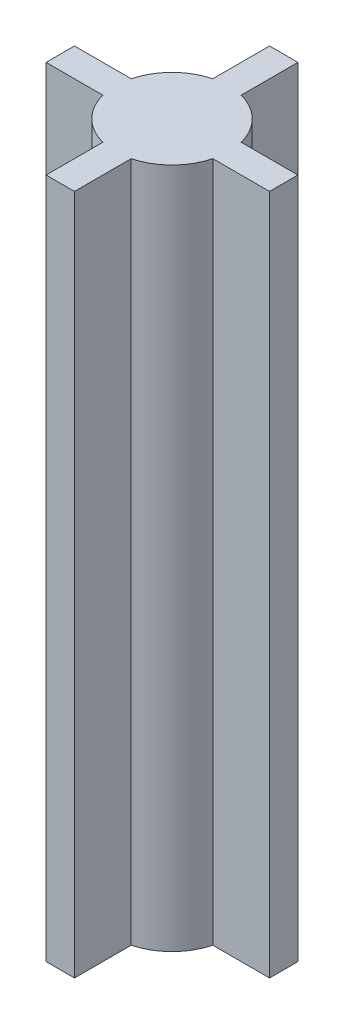
ISO-10303-21;
HEADER;
FILE_DESCRIPTION(('STEP AP214'),'2;1');
FILE_NAME('part.step','',(''),(''),'','','');
FILE_SCHEMA(('AUTOMOTIVE_DESIGN { 1 0 10303 214 1 1 1 1 }'));
ENDSEC;
DATA;
#1=APPLICATION_CONTEXT('core data for automotive mechanical design processes');
#2=APPLICATION_PROTOCOL_DEFINITION('international standard','automotive_design',2000,#1);
#3=PRODUCT_CONTEXT('',#1,'mechanical');
#4=PRODUCT('Part','Part','',(#3));
#5=PRODUCT_RELATED_PRODUCT_CATEGORY('part','',(#4));
#6=PRODUCT_DEFINITION_FORMATION('','',#4);
#7=PRODUCT_DEFINITION_CONTEXT('part definition',#1,'design');
#8=PRODUCT_DEFINITION('design','',#6,#7);
#9=PRODUCT_DEFINITION_SHAPE('','',#8);
#10=(LENGTH_UNIT() NAMED_UNIT(*) SI_UNIT(.MILLI.,.METRE.));
#11=(NAMED_UNIT(*) PLANE_ANGLE_UNIT() SI_UNIT($,.RADIAN.));
#12=(NAMED_UNIT(*) SI_UNIT($,.STERADIAN.) SOLID_ANGLE_UNIT());
#13=UNCERTAINTY_MEASURE_WITH_UNIT(LENGTH_MEASURE(1.E-05),#10,'distance_accuracy_value','');
#14=(GEOMETRIC_REPRESENTATION_CONTEXT(3) GLOBAL_UNCERTAINTY_ASSIGNED_CONTEXT((#13)) GLOBAL_UNIT_ASSIGNED_CONTEXT((#10,
#11,#12)) REPRESENTATION_CONTEXT('',''));
#15=CARTESIAN_POINT('',(0.,0.,0.));
#16=DIRECTION('',(0.,0.,1.));
#17=DIRECTION('',(1.,0.,0.));
#18=AXIS2_PLACEMENT_3D('',#15,#16,#17);
#19=CARTESIAN_POINT('',(0.,152.4,0.));
#20=DIRECTION('',(0.,-1.,0.));
#21=DIRECTION('',(0.,0.,-1.));
#22=AXIS2_PLACEMENT_3D('',#19,#20,#21);
#23=CYLINDRICAL_SURFACE('',#22,12.7);
#24=CARTESIAN_POINT('',(0.,0.,0.));
#25=DIRECTION('',(0.,1.,0.));
#26=DIRECTION('',(0.,0.,1.));
#27=AXIS2_PLACEMENT_3D('',#24,#25,#26);
#28=CIRCLE('',#27,12.7);
#29=CARTESIAN_POINT('',(-3.175,0.,-12.2967221242086));
#30=VERTEX_POINT('',#29);
#31=CARTESIAN_POINT('',(-12.2967221242079,0.,-3.17499999999941));
#32=VERTEX_POINT('',#31);
#33=EDGE_CURVE('E199',#30,#32,#28,.T.);
#34=ORIENTED_EDGE('',*,*,#33,.T.);
#35=DIRECTION('',(0.,-1.,0.));
#36=VECTOR('',#35,1.);
#37=CARTESIAN_POINT('',(-12.2967221242079,152.4,-3.17499999999941));
#38=LINE('',#37,#36);
#39=CARTESIAN_POINT('',(-12.2967221242079,152.4,-3.17499999999941));
#40=VERTEX_POINT('',#39);
#41=EDGE_CURVE('E11',#40,#32,#38,.T.);
#42=ORIENTED_EDGE('',*,*,#41,.F.);
#43=CARTESIAN_POINT('',(0.,152.4,0.));
#44=DIRECTION('',(0.,1.,0.));
#45=DIRECTION('',(0.,0.,1.));
#46=AXIS2_PLACEMENT_3D('',#43,#44,#45);
#47=CIRCLE('',#46,12.7);
#48=CARTESIAN_POINT('',(-3.175,152.4,-12.2967221242086));
#49=VERTEX_POINT('',#48);
#50=EDGE_CURVE('E250',#49,#40,#47,.T.);
#51=ORIENTED_EDGE('',*,*,#50,.F.);
#52=DIRECTION('',(0.,-1.,0.));
#53=VECTOR('',#52,1.);
#54=CARTESIAN_POINT('',(-3.175,152.4,-12.2967221242086));
#55=LINE('',#54,#53);
#56=EDGE_CURVE('E65',#49,#30,#55,.T.);
#57=ORIENTED_EDGE('',*,*,#56,.T.);
#58=EDGE_LOOP('',(#34,#42,#51,#57));
#59=FACE_BOUND('',#58,.T.);
#60=ADVANCED_FACE('F47',(#59),#23,.T.);
#61=CARTESIAN_POINT('',(0.,152.4,-3.17499999999922));
#62=DIRECTION('',(0.,0.,1.));
#63=DIRECTION('',(1.,0.,0.));
#64=AXIS2_PLACEMENT_3D('',#61,#62,#63);
#65=PLANE('',#64);
#66=DIRECTION('',(-1.,0.,0.));
#67=VECTOR('',#66,1.);
#68=CARTESIAN_POINT('',(0.,0.,-3.17499999999922));
#69=LINE('',#68,#67);
#70=CARTESIAN_POINT('',(-24.9967221242072,0.,-3.17499999999922));
#71=VERTEX_POINT('',#70);
#72=EDGE_CURVE('E202',#32,#71,#69,.T.);
#73=ORIENTED_EDGE('',*,*,#72,.T.);
#74=DIRECTION('',(0.,-1.,0.));
#75=VECTOR('',#74,1.);
#76=CARTESIAN_POINT('',(-24.9967221242072,152.4,-3.17499999999922));
#77=LINE('',#76,#75);
#78=CARTESIAN_POINT('',(-24.9967221242072,152.4,-3.17499999999922));
#79=VERTEX_POINT('',#78);
#80=EDGE_CURVE('E57',#79,#71,#77,.T.);
#81=ORIENTED_EDGE('',*,*,#80,.F.);
#82=DIRECTION('',(-1.,0.,0.));
#83=VECTOR('',#82,1.);
#84=CARTESIAN_POINT('',(0.,152.4,-3.17499999999922));
#85=LINE('',#84,#83);
#86=EDGE_CURVE('E127',#40,#79,#85,.T.);
#87=ORIENTED_EDGE('',*,*,#86,.F.);
#88=ORIENTED_EDGE('',*,*,#41,.T.);
#89=EDGE_LOOP('',(#73,#81,#87,#88));
#90=FACE_BOUND('',#89,.T.);
#91=ADVANCED_FACE('F49',(#90),#65,.F.);
#92=CARTESIAN_POINT('',(-24.9967221242072,152.4,0.));
#93=DIRECTION('',(-1.,0.,0.));
#94=DIRECTION('',(0.,0.,1.));
#95=AXIS2_PLACEMENT_3D('',#92,#93,#94);
#96=PLANE('',#95);
#97=DIRECTION('',(0.,0.,-1.));
#98=VECTOR('',#97,1.);
#99=CARTESIAN_POINT('',(-24.9967221242072,0.,0.));
#100=LINE('',#99,#98);
#101=CARTESIAN_POINT('',(-24.9967221242072,0.,3.17500000000078));
#102=VERTEX_POINT('',#101);
#103=EDGE_CURVE('E208',#102,#71,#100,.T.);
#104=ORIENTED_EDGE('',*,*,#103,.F.);
#105=DIRECTION('',(0.,-1.,0.));
#106=VECTOR('',#105,1.);
#107=CARTESIAN_POINT('',(-24.9967221242072,152.4,3.17500000000078));
#108=LINE('',#107,#106);
#109=CARTESIAN_POINT('',(-24.9967221242072,152.4,3.17500000000078));
#110=VERTEX_POINT('',#109);
#111=EDGE_CURVE('E286',#110,#102,#108,.T.);
#112=ORIENTED_EDGE('',*,*,#111,.F.);
#113=DIRECTION('',(0.,0.,-1.));
#114=VECTOR('',#113,1.);
#115=CARTESIAN_POINT('',(-24.9967221242072,152.4,0.));
#116=LINE('',#115,#114);
#117=EDGE_CURVE('E294',#110,#79,#116,.T.);
#118=ORIENTED_EDGE('',*,*,#117,.T.);
#119=ORIENTED_EDGE('',*,*,#80,.T.);
#120=EDGE_LOOP('',(#104,#112,#118,#119));
#121=FACE_BOUND('',#120,.T.);
#122=ADVANCED_FACE('F292',(#121),#96,.T.);
#123=CARTESIAN_POINT('',(0.,152.4,3.17500000000077));
#124=DIRECTION('',(0.,0.,1.));
#125=DIRECTION('',(1.,0.,0.));
#126=AXIS2_PLACEMENT_3D('',#123,#124,#125);
#127=PLANE('',#126);
#128=DIRECTION('',(-1.,0.,0.));
#129=VECTOR('',#128,1.);
#130=CARTESIAN_POINT('',(0.,0.,3.17500000000077));
#131=LINE('',#130,#129);
#132=CARTESIAN_POINT('',(-12.2967221242078,0.,3.1750000000009));
#133=VERTEX_POINT('',#132);
#134=EDGE_CURVE('E212',#133,#102,#131,.T.);
#135=ORIENTED_EDGE('',*,*,#134,.F.);
#136=DIRECTION('',(0.,-1.,0.));
#137=VECTOR('',#136,1.);
#138=CARTESIAN_POINT('',(-12.2967221242078,152.4,3.1750000000009));
#139=LINE('',#138,#137);
#140=CARTESIAN_POINT('',(-12.2967221242078,152.4,3.1750000000009));
#141=VERTEX_POINT('',#140);
#142=EDGE_CURVE('E283',#141,#133,#139,.T.);
#143=ORIENTED_EDGE('',*,*,#142,.F.);
#144=DIRECTION('',(-1.,0.,0.));
#145=VECTOR('',#144,1.);
#146=CARTESIAN_POINT('',(0.,152.4,3.17500000000077));
#147=LINE('',#146,#145);
#148=EDGE_CURVE('E306',#141,#110,#147,.T.);
#149=ORIENTED_EDGE('',*,*,#148,.T.);
#150=ORIENTED_EDGE('',*,*,#111,.T.);
#151=EDGE_LOOP('',(#135,#143,#149,#150));
#152=FACE_BOUND('',#151,.T.);
#153=ADVANCED_FACE('F302',(#152),#127,.T.);
#154=CARTESIAN_POINT('',(-3.17499999999805,0.,12.2967221242085));
#155=VERTEX_POINT('',#154);
#156=EDGE_CURVE('E204',#133,#155,#28,.T.);
#157=ORIENTED_EDGE('',*,*,#156,.T.);
#158=DIRECTION('',(0.,-1.,0.));
#159=VECTOR('',#158,1.);
#160=CARTESIAN_POINT('',(-3.17499999999805,152.4,12.2967221242085));
#161=LINE('',#160,#159);
#162=CARTESIAN_POINT('',(-3.17499999999805,152.4,12.2967221242085));
#163=VERTEX_POINT('',#162);
#164=EDGE_CURVE('E279',#163,#155,#161,.T.);
#165=ORIENTED_EDGE('',*,*,#164,.F.);
#166=EDGE_CURVE('E311',#141,#163,#47,.T.);
#167=ORIENTED_EDGE('',*,*,#166,.F.);
#168=ORIENTED_EDGE('',*,*,#142,.T.);
#169=EDGE_LOOP('',(#157,#165,#167,#168));
#170=FACE_BOUND('',#169,.T.);
#171=ADVANCED_FACE('F347',(#170),#23,.T.);
#172=CARTESIAN_POINT('',(-3.17499999999792,152.4,0.));
#173=DIRECTION('',(1.,0.,0.));
#174=DIRECTION('',(0.,0.,-1.));
#175=AXIS2_PLACEMENT_3D('',#172,#173,#174);
#176=PLANE('',#175);
#177=DIRECTION('',(0.,0.,1.));
#178=VECTOR('',#177,1.);
#179=CARTESIAN_POINT('',(-3.17499999999792,0.,0.));
#180=LINE('',#179,#178);
#181=CARTESIAN_POINT('',(-3.17499999999792,0.,24.996722124208));
#182=VERTEX_POINT('',#181);
#183=EDGE_CURVE('E216',#155,#182,#180,.T.);
#184=ORIENTED_EDGE('',*,*,#183,.T.);
#185=DIRECTION('',(0.,-1.,0.));
#186=VECTOR('',#185,1.);
#187=CARTESIAN_POINT('',(-3.17499999999792,152.4,24.996722124208));
#188=LINE('',#187,#186);
#189=CARTESIAN_POINT('',(-3.17499999999792,152.4,24.996722124208));
#190=VERTEX_POINT('',#189);
#191=EDGE_CURVE('E276',#190,#182,#188,.T.);
#192=ORIENTED_EDGE('',*,*,#191,.F.);
#193=DIRECTION('',(0.,0.,1.));
#194=VECTOR('',#193,1.);
#195=CARTESIAN_POINT('',(-3.17499999999792,152.4,0.));
#196=LINE('',#195,#194);
#197=EDGE_CURVE('E316',#163,#190,#196,.T.);
#198=ORIENTED_EDGE('',*,*,#197,.F.);
#199=ORIENTED_EDGE('',*,*,#164,.T.);
#200=EDGE_LOOP('',(#184,#192,#198,#199));
#201=FACE_BOUND('',#200,.T.);
#202=ADVANCED_FACE('F349',(#201),#176,.F.);
#203=CARTESIAN_POINT('',(0.,152.4,24.996722124208));
#204=DIRECTION('',(0.,0.,1.));
#205=DIRECTION('',(1.,0.,0.));
#206=AXIS2_PLACEMENT_3D('',#203,#204,#205);
#207=PLANE('',#206);
#208=DIRECTION('',(-1.,0.,0.));
#209=VECTOR('',#208,1.);
#210=CARTESIAN_POINT('',(0.,0.,24.996722124208));
#211=LINE('',#210,#209);
#212=CARTESIAN_POINT('',(3.17500000000208,0.,24.996722124208));
#213=VERTEX_POINT('',#212);
#214=EDGE_CURVE('E220',#213,#182,#211,.T.);
#215=ORIENTED_EDGE('',*,*,#214,.F.);
#216=DIRECTION('',(0.,-1.,0.));
#217=VECTOR('',#216,1.);
#218=CARTESIAN_POINT('',(3.17500000000208,152.4,24.996722124208));
#219=LINE('',#218,#217);
#220=CARTESIAN_POINT('',(3.17500000000208,152.4,24.996722124208));
#221=VERTEX_POINT('',#220);
#222=EDGE_CURVE('E273',#221,#213,#219,.T.);
#223=ORIENTED_EDGE('',*,*,#222,.F.);
#224=DIRECTION('',(-1.,0.,0.));
#225=VECTOR('',#224,1.);
#226=CARTESIAN_POINT('',(0.,152.4,24.996722124208));
#227=LINE('',#226,#225);
#228=EDGE_CURVE('E319',#221,#190,#227,.T.);
#229=ORIENTED_EDGE('',*,*,#228,.T.);
#230=ORIENTED_EDGE('',*,*,#191,.T.);
#231=EDGE_LOOP('',(#215,#223,#229,#230));
#232=FACE_BOUND('',#231,.T.);
#233=ADVANCED_FACE('F352',(#232),#207,.T.);
#234=CARTESIAN_POINT('',(3.17500000000207,152.4,0.));
#235=DIRECTION('',(1.,0.,0.));
#236=DIRECTION('',(0.,0.,-1.));
#237=AXIS2_PLACEMENT_3D('',#234,#235,#236);
#238=PLANE('',#237);
#239=DIRECTION('',(0.,0.,1.));
#240=VECTOR('',#239,1.);
#241=CARTESIAN_POINT('',(3.17500000000207,0.,0.));
#242=LINE('',#241,#240);
#243=CARTESIAN_POINT('',(3.17500000000208,0.,12.296722124208));
#244=VERTEX_POINT('',#243);
#245=EDGE_CURVE('E224',#244,#213,#242,.T.);
#246=ORIENTED_EDGE('',*,*,#245,.F.);
#247=DIRECTION('',(0.,-1.,0.));
#248=VECTOR('',#247,1.);
#249=CARTESIAN_POINT('',(3.17500000000208,152.4,12.296722124208));
#250=LINE('',#249,#248);
#251=CARTESIAN_POINT('',(3.17500000000208,152.4,12.296722124208));
#252=VERTEX_POINT('',#251);
#253=EDGE_CURVE('E270',#252,#244,#250,.T.);
#254=ORIENTED_EDGE('',*,*,#253,.F.);
#255=DIRECTION('',(0.,0.,1.));
#256=VECTOR('',#255,1.);
#257=CARTESIAN_POINT('',(3.17500000000207,152.4,0.));
#258=LINE('',#257,#256);
#259=EDGE_CURVE('E323',#252,#221,#258,.T.);
#260=ORIENTED_EDGE('',*,*,#259,.T.);
#261=ORIENTED_EDGE('',*,*,#222,.T.);
#262=EDGE_LOOP('',(#246,#254,#260,#261));
#263=FACE_BOUND('',#262,.T.);
#264=ADVANCED_FACE('F356',(#263),#238,.T.);
#265=CARTESIAN_POINT('',(12.2967221242091,0.,3.17499999999864));
#266=VERTEX_POINT('',#265);
#267=EDGE_CURVE('E228',#244,#266,#28,.T.);
#268=ORIENTED_EDGE('',*,*,#267,.T.);
#269=DIRECTION('',(0.,-1.,0.));
#270=VECTOR('',#269,1.);
#271=CARTESIAN_POINT('',(12.2967221242091,152.4,3.17499999999864));
#272=LINE('',#271,#270);
#273=CARTESIAN_POINT('',(12.2967221242091,152.4,3.17499999999864));
#274=VERTEX_POINT('',#273);
#275=EDGE_CURVE('E266',#274,#266,#272,.T.);
#276=ORIENTED_EDGE('',*,*,#275,.F.);
#277=EDGE_CURVE('E327',#252,#274,#47,.T.);
#278=ORIENTED_EDGE('',*,*,#277,.F.);
#279=ORIENTED_EDGE('',*,*,#253,.T.);
#280=EDGE_LOOP('',(#268,#276,#278,#279));
#281=FACE_BOUND('',#280,.T.);
#282=ADVANCED_FACE('F361',(#281),#23,.T.);
#283=CARTESIAN_POINT('',(0.,152.4,3.17499999999869));
#284=DIRECTION('',(0.,0.,-1.));
#285=DIRECTION('',(-1.,0.,0.));
#286=AXIS2_PLACEMENT_3D('',#283,#284,#285);
#287=PLANE('',#286);
#288=DIRECTION('',(1.,0.,0.));
#289=VECTOR('',#288,1.);
#290=CARTESIAN_POINT('',(0.,0.,3.17499999999869));
#291=LINE('',#290,#289);
#292=CARTESIAN_POINT('',(24.9967221242093,0.,3.17499999999869));
#293=VERTEX_POINT('',#292);
#294=EDGE_CURVE('E229',#266,#293,#291,.T.);
#295=ORIENTED_EDGE('',*,*,#294,.T.);
#296=DIRECTION('',(0.,-1.,0.));
#297=VECTOR('',#296,1.);
#298=CARTESIAN_POINT('',(24.9967221242093,152.4,3.17499999999869));
#299=LINE('',#298,#297);
#300=CARTESIAN_POINT('',(24.9967221242093,152.4,3.17499999999869));
#301=VERTEX_POINT('',#300);
#302=EDGE_CURVE('E263',#301,#293,#299,.T.);
#303=ORIENTED_EDGE('',*,*,#302,.F.);
#304=DIRECTION('',(1.,0.,0.));
#305=VECTOR('',#304,1.);
#306=CARTESIAN_POINT('',(0.,152.4,3.17499999999869));
#307=LINE('',#306,#305);
#308=EDGE_CURVE('E328',#274,#301,#307,.T.);
#309=ORIENTED_EDGE('',*,*,#308,.F.);
#310=ORIENTED_EDGE('',*,*,#275,.T.);
#311=EDGE_LOOP('',(#295,#303,#309,#310));
#312=FACE_BOUND('',#311,.T.);
#313=ADVANCED_FACE('F366',(#312),#287,.F.);
#314=CARTESIAN_POINT('',(24.9967221242093,152.4,0.));
#315=DIRECTION('',(1.,0.,0.));
#316=DIRECTION('',(0.,0.,-1.));
#317=AXIS2_PLACEMENT_3D('',#314,#315,#316);
#318=PLANE('',#317);
#319=DIRECTION('',(0.,0.,1.));
#320=VECTOR('',#319,1.);
#321=CARTESIAN_POINT('',(24.9967221242093,0.,0.));
#322=LINE('',#321,#320);
#323=CARTESIAN_POINT('',(24.9967221242093,0.,-3.17500000000131));
#324=VERTEX_POINT('',#323);
#325=EDGE_CURVE('E233',#324,#293,#322,.T.);
#326=ORIENTED_EDGE('',*,*,#325,.F.);
#327=DIRECTION('',(0.,-1.,0.));
#328=VECTOR('',#327,1.);
#329=CARTESIAN_POINT('',(24.9967221242093,152.4,-3.17500000000131));
#330=LINE('',#329,#328);
#331=CARTESIAN_POINT('',(24.9967221242093,152.4,-3.17500000000131));
#332=VERTEX_POINT('',#331);
#333=EDGE_CURVE('E260',#332,#324,#330,.T.);
#334=ORIENTED_EDGE('',*,*,#333,.F.);
#335=DIRECTION('',(0.,0.,1.));
#336=VECTOR('',#335,1.);
#337=CARTESIAN_POINT('',(24.9967221242093,152.4,0.));
#338=LINE('',#337,#336);
#339=EDGE_CURVE('E331',#332,#301,#338,.T.);
#340=ORIENTED_EDGE('',*,*,#339,.T.);
#341=ORIENTED_EDGE('',*,*,#302,.T.);
#342=EDGE_LOOP('',(#326,#334,#340,#341));
#343=FACE_BOUND('',#342,.T.);
#344=ADVANCED_FACE('F370',(#343),#318,.T.);
#345=CARTESIAN_POINT('',(0.,152.4,-3.1750000000013));
#346=DIRECTION('',(0.,0.,-1.));
#347=DIRECTION('',(-1.,0.,0.));
#348=AXIS2_PLACEMENT_3D('',#345,#346,#347);
#349=PLANE('',#348);
#350=DIRECTION('',(1.,0.,0.));
#351=VECTOR('',#350,1.);
#352=CARTESIAN_POINT('',(0.,0.,-3.1750000000013));
#353=LINE('',#352,#351);
#354=CARTESIAN_POINT('',(12.2967221242088,0.,-3.17500000000117));
#355=VERTEX_POINT('',#354);
#356=EDGE_CURVE('E237',#355,#324,#353,.T.);
#357=ORIENTED_EDGE('',*,*,#356,.F.);
#358=DIRECTION('',(0.,-1.,0.));
#359=VECTOR('',#358,1.);
#360=CARTESIAN_POINT('',(12.2967221242088,152.4,-3.17500000000117));
#361=LINE('',#360,#359);
#362=CARTESIAN_POINT('',(12.2967221242088,152.4,-3.17500000000117));
#363=VERTEX_POINT('',#362);
#364=EDGE_CURVE('E257',#363,#355,#361,.T.);
#365=ORIENTED_EDGE('',*,*,#364,.F.);
#366=DIRECTION('',(1.,0.,0.));
#367=VECTOR('',#366,1.);
#368=CARTESIAN_POINT('',(0.,152.4,-3.1750000000013));
#369=LINE('',#368,#367);
#370=EDGE_CURVE('E334',#363,#332,#369,.T.);
#371=ORIENTED_EDGE('',*,*,#370,.T.);
#372=ORIENTED_EDGE('',*,*,#333,.T.);
#373=EDGE_LOOP('',(#357,#365,#371,#372));
#374=FACE_BOUND('',#373,.T.);
#375=ADVANCED_FACE('F372',(#374),#349,.T.);
#376=CARTESIAN_POINT('',(3.175,0.,-12.2967221242086));
#377=VERTEX_POINT('',#376);
#378=EDGE_CURVE('E203',#355,#377,#28,.T.);
#379=ORIENTED_EDGE('',*,*,#378,.T.);
#380=DIRECTION('',(0.,-1.,0.));
#381=VECTOR('',#380,1.);
#382=CARTESIAN_POINT('',(3.175,152.4,-12.2967221242086));
#383=LINE('',#382,#381);
#384=CARTESIAN_POINT('',(3.175,152.4,-12.2967221242086));
#385=VERTEX_POINT('',#384);
#386=EDGE_CURVE('E189',#385,#377,#383,.T.);
#387=ORIENTED_EDGE('',*,*,#386,.F.);
#388=EDGE_CURVE('E175',#363,#385,#47,.T.);
#389=ORIENTED_EDGE('',*,*,#388,.F.);
#390=ORIENTED_EDGE('',*,*,#364,.T.);
#391=EDGE_LOOP('',(#379,#387,#389,#390));
#392=FACE_BOUND('',#391,.T.);
#393=ADVANCED_FACE('F378',(#392),#23,.T.);
#394=CARTESIAN_POINT('',(3.175,152.4,0.));
#395=DIRECTION('',(-1.,0.,0.));
#396=DIRECTION('',(0.,0.,1.));
#397=AXIS2_PLACEMENT_3D('',#394,#395,#396);
#398=PLANE('',#397);
#399=DIRECTION('',(0.,0.,-1.));
#400=VECTOR('',#399,1.);
#401=CARTESIAN_POINT('',(3.175,0.,0.));
#402=LINE('',#401,#400);
#403=CARTESIAN_POINT('',(3.175,0.,-24.9967221242085));
#404=VERTEX_POINT('',#403);
#405=EDGE_CURVE('E185',#377,#404,#402,.T.);
#406=ORIENTED_EDGE('',*,*,#405,.T.);
#407=DIRECTION('',(0.,-1.,0.));
#408=VECTOR('',#407,1.);
#409=CARTESIAN_POINT('',(3.175,152.4,-24.9967221242085));
#410=LINE('',#409,#408);
#411=CARTESIAN_POINT('',(3.175,152.4,-24.9967221242085));
#412=VERTEX_POINT('',#411);
#413=EDGE_CURVE('E182',#412,#404,#410,.T.);
#414=ORIENTED_EDGE('',*,*,#413,.F.);
#415=DIRECTION('',(0.,0.,-1.));
#416=VECTOR('',#415,1.);
#417=CARTESIAN_POINT('',(3.175,152.4,0.));
#418=LINE('',#417,#416);
#419=EDGE_CURVE('E167',#385,#412,#418,.T.);
#420=ORIENTED_EDGE('',*,*,#419,.F.);
#421=ORIENTED_EDGE('',*,*,#386,.T.);
#422=EDGE_LOOP('',(#406,#414,#420,#421));
#423=FACE_BOUND('',#422,.T.);
#424=ADVANCED_FACE('F183',(#423),#398,.F.);
#425=CARTESIAN_POINT('',(0.,152.4,-24.9967221242085));
#426=DIRECTION('',(0.,0.,-1.));
#427=DIRECTION('',(-1.,0.,0.));
#428=AXIS2_PLACEMENT_3D('',#425,#426,#427);
#429=PLANE('',#428);
#430=DIRECTION('',(1.,0.,0.));
#431=VECTOR('',#430,1.);
#432=CARTESIAN_POINT('',(0.,0.,-24.9967221242085));
#433=LINE('',#432,#431);
#434=CARTESIAN_POINT('',(-3.175,0.,-24.9967221242085));
#435=VERTEX_POINT('',#434);
#436=EDGE_CURVE('E243',#435,#404,#433,.T.);
#437=ORIENTED_EDGE('',*,*,#436,.F.);
#438=DIRECTION('',(0.,-1.,0.));
#439=VECTOR('',#438,1.);
#440=CARTESIAN_POINT('',(-3.175,152.4,-24.9967221242085));
#441=LINE('',#440,#439);
#442=CARTESIAN_POINT('',(-3.175,152.4,-24.9967221242085));
#443=VERTEX_POINT('',#442);
#444=EDGE_CURVE('E115',#443,#435,#441,.T.);
#445=ORIENTED_EDGE('',*,*,#444,.F.);
#446=DIRECTION('',(1.,0.,0.));
#447=VECTOR('',#446,1.);
#448=CARTESIAN_POINT('',(0.,152.4,-24.9967221242085));
#449=LINE('',#448,#447);
#450=EDGE_CURVE('E172',#443,#412,#449,.T.);
#451=ORIENTED_EDGE('',*,*,#450,.T.);
#452=ORIENTED_EDGE('',*,*,#413,.T.);
#453=EDGE_LOOP('',(#437,#445,#451,#452));
#454=FACE_BOUND('',#453,.T.);
#455=ADVANCED_FACE('F191',(#454),#429,.T.);
#456=CARTESIAN_POINT('',(-3.175,152.4,0.));
#457=DIRECTION('',(-1.,0.,0.));
#458=DIRECTION('',(0.,0.,1.));
#459=AXIS2_PLACEMENT_3D('',#456,#457,#458);
#460=PLANE('',#459);
#461=DIRECTION('',(0.,0.,-1.));
#462=VECTOR('',#461,1.);
#463=CARTESIAN_POINT('',(-3.175,0.,0.));
#464=LINE('',#463,#462);
#465=EDGE_CURVE('E246',#30,#435,#464,.T.);
#466=ORIENTED_EDGE('',*,*,#465,.F.);
#467=ORIENTED_EDGE('',*,*,#56,.F.);
#468=DIRECTION('',(0.,0.,-1.));
#469=VECTOR('',#468,1.);
#470=CARTESIAN_POINT('',(-3.175,152.4,0.));
#471=LINE('',#470,#469);
#472=EDGE_CURVE('E193',#49,#443,#471,.T.);
#473=ORIENTED_EDGE('',*,*,#472,.T.);
#474=ORIENTED_EDGE('',*,*,#444,.T.);
#475=EDGE_LOOP('',(#466,#467,#473,#474));
#476=FACE_BOUND('',#475,.T.);
#477=ADVANCED_FACE('F438',(#476),#460,.T.);
#478=CARTESIAN_POINT('',(0.,152.4,0.));
#479=DIRECTION('',(0.,1.,0.));
#480=DIRECTION('',(0.,0.,1.));
#481=AXIS2_PLACEMENT_3D('',#478,#479,#480);
#482=PLANE('',#481);
#483=ORIENTED_EDGE('',*,*,#50,.T.);
#484=ORIENTED_EDGE('',*,*,#86,.T.);
#485=ORIENTED_EDGE('',*,*,#117,.F.);
#486=ORIENTED_EDGE('',*,*,#148,.F.);
#487=ORIENTED_EDGE('',*,*,#166,.T.);
#488=ORIENTED_EDGE('',*,*,#197,.T.);
#489=ORIENTED_EDGE('',*,*,#228,.F.);
#490=ORIENTED_EDGE('',*,*,#259,.F.);
#491=ORIENTED_EDGE('',*,*,#277,.T.);
#492=ORIENTED_EDGE('',*,*,#308,.T.);
#493=ORIENTED_EDGE('',*,*,#339,.F.);
#494=ORIENTED_EDGE('',*,*,#370,.F.);
#495=ORIENTED_EDGE('',*,*,#388,.T.);
#496=ORIENTED_EDGE('',*,*,#419,.T.);
#497=ORIENTED_EDGE('',*,*,#450,.F.);
#498=ORIENTED_EDGE('',*,*,#472,.F.);
#499=EDGE_LOOP('',(#483,#484,#485,#486,#487,#488,#489,#490,#491,#492,#493,#494,#495,#496,#497,#498));
#500=FACE_BOUND('',#499,.T.);
#501=ADVANCED_FACE('F169',(#500),#482,.T.);
#502=CARTESIAN_POINT('',(0.,0.,0.));
#503=DIRECTION('',(0.,1.,0.));
#504=DIRECTION('',(0.,0.,1.));
#505=AXIS2_PLACEMENT_3D('',#502,#503,#504);
#506=PLANE('',#505);
#507=ORIENTED_EDGE('',*,*,#33,.F.);
#508=ORIENTED_EDGE('',*,*,#465,.T.);
#509=ORIENTED_EDGE('',*,*,#436,.T.);
#510=ORIENTED_EDGE('',*,*,#405,.F.);
#511=ORIENTED_EDGE('',*,*,#378,.F.);
#512=ORIENTED_EDGE('',*,*,#356,.T.);
#513=ORIENTED_EDGE('',*,*,#325,.T.);
#514=ORIENTED_EDGE('',*,*,#294,.F.);
#515=ORIENTED_EDGE('',*,*,#267,.F.);
#516=ORIENTED_EDGE('',*,*,#245,.T.);
#517=ORIENTED_EDGE('',*,*,#214,.T.);
#518=ORIENTED_EDGE('',*,*,#183,.F.);
#519=ORIENTED_EDGE('',*,*,#156,.F.);
#520=ORIENTED_EDGE('',*,*,#134,.T.);
#521=ORIENTED_EDGE('',*,*,#103,.T.);
#522=ORIENTED_EDGE('',*,*,#72,.F.);
#523=EDGE_LOOP('',(#507,#508,#509,#510,#511,#512,#513,#514,#515,#516,#517,#518,#519,#520,#521,#522));
#524=FACE_BOUND('',#523,.T.);
#525=ADVANCED_FACE('F297',(#524),#506,.F.);
#526=CLOSED_SHELL('',(#60,#91,#122,#153,#171,#202,#233,#264,#282,#313,#344,#375,#393,#424,#455,
#477,#501,#525));
#527=MANIFOLD_SOLID_BREP('B2',#526);
#528=ADVANCED_BREP_SHAPE_REPRESENTATION('',(#18,#527),#14);
#529=SHAPE_DEFINITION_REPRESENTATION(#9,#528);
ENDSEC;
END-ISO-10303-21;
